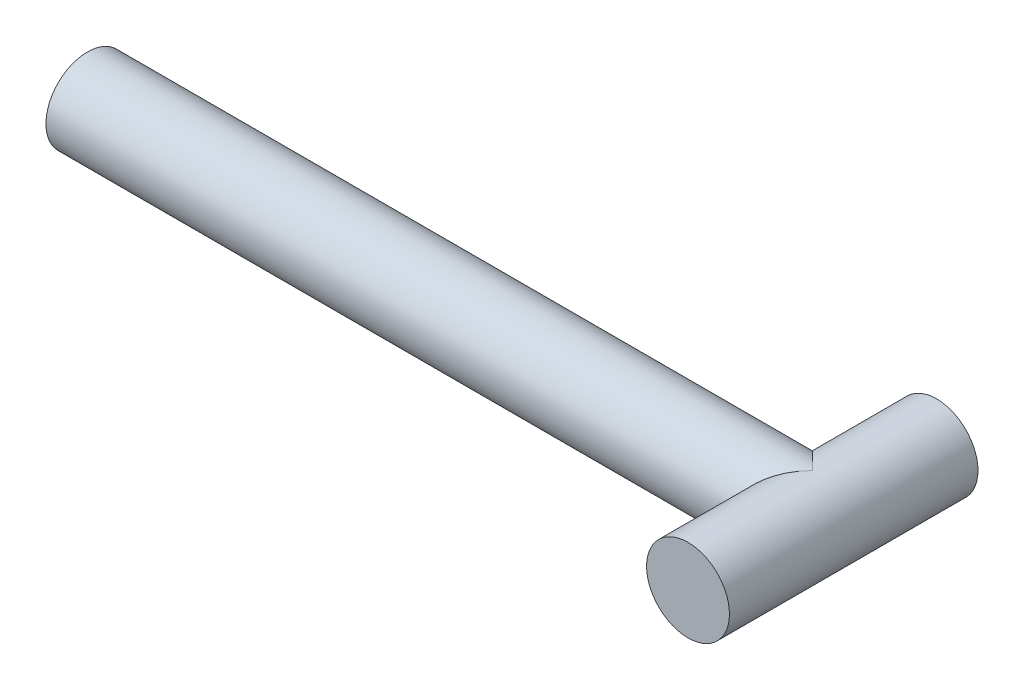
ISO-10303-21;
HEADER;
FILE_DESCRIPTION(('STEP AP214'),'2;1');
FILE_NAME('part.step','',(''),(''),'','','');
FILE_SCHEMA(('AUTOMOTIVE_DESIGN { 1 0 10303 214 1 1 1 1 }'));
ENDSEC;
DATA;
#1=APPLICATION_CONTEXT('core data for automotive mechanical design processes');
#2=APPLICATION_PROTOCOL_DEFINITION('international standard','automotive_design',2000,#1);
#3=PRODUCT_CONTEXT('',#1,'mechanical');
#4=PRODUCT('Part','Part','',(#3));
#5=PRODUCT_RELATED_PRODUCT_CATEGORY('part','',(#4));
#6=PRODUCT_DEFINITION_FORMATION('','',#4);
#7=PRODUCT_DEFINITION_CONTEXT('part definition',#1,'design');
#8=PRODUCT_DEFINITION('design','',#6,#7);
#9=PRODUCT_DEFINITION_SHAPE('','',#8);
#10=(LENGTH_UNIT() NAMED_UNIT(*) SI_UNIT(.MILLI.,.METRE.));
#11=(NAMED_UNIT(*) PLANE_ANGLE_UNIT() SI_UNIT($,.RADIAN.));
#12=(NAMED_UNIT(*) SI_UNIT($,.STERADIAN.) SOLID_ANGLE_UNIT());
#13=UNCERTAINTY_MEASURE_WITH_UNIT(LENGTH_MEASURE(1.E-05),#10,'distance_accuracy_value','');
#14=(GEOMETRIC_REPRESENTATION_CONTEXT(3) GLOBAL_UNCERTAINTY_ASSIGNED_CONTEXT((#13)) GLOBAL_UNIT_ASSIGNED_CONTEXT((#10,
#11,#12)) REPRESENTATION_CONTEXT('',''));
#15=CARTESIAN_POINT('',(0.,0.,0.));
#16=DIRECTION('',(0.,0.,1.));
#17=DIRECTION('',(1.,0.,0.));
#18=AXIS2_PLACEMENT_3D('',#15,#16,#17);
#19=CARTESIAN_POINT('',(0.,0.,12.));
#20=DIRECTION('',(0.,0.,-1.));
#21=DIRECTION('',(-1.,0.,0.));
#22=AXIS2_PLACEMENT_3D('',#19,#20,#21);
#23=CYLINDRICAL_SURFACE('',#22,4.);
#24=CARTESIAN_POINT('',(0.,0.,0.));
#25=DIRECTION('',(0.707106781186547,0.,-0.707106781186547));
#26=DIRECTION('',(0.707106781186547,0.,0.707106781186547));
#27=AXIS2_PLACEMENT_3D('',#24,#25,#26);
#28=ELLIPSE('',#27,5.65685424949238,4.);
#29=CARTESIAN_POINT('',(0.,4.,0.));
#30=VERTEX_POINT('',#29);
#31=CARTESIAN_POINT('',(0.,-4.,0.));
#32=VERTEX_POINT('',#31);
#33=EDGE_CURVE('E43',#30,#32,#28,.F.);
#34=ORIENTED_EDGE('',*,*,#33,.F.);
#35=CARTESIAN_POINT('',(0.,0.,0.));
#36=DIRECTION('',(0.707106781186547,0.,0.707106781186547));
#37=DIRECTION('',(0.707106781186547,0.,-0.707106781186547));
#38=AXIS2_PLACEMENT_3D('',#35,#36,#37);
#39=ELLIPSE('',#38,5.65685424949238,4.);
#40=EDGE_CURVE('E50',#32,#30,#39,.F.);
#41=ORIENTED_EDGE('',*,*,#40,.F.);
#42=EDGE_LOOP('',(#34,#41));
#43=FACE_BOUND('',#42,.T.);
#44=CARTESIAN_POINT('',(0.,0.,12.));
#45=DIRECTION('',(0.,0.,1.));
#46=DIRECTION('',(1.,0.,0.));
#47=AXIS2_PLACEMENT_3D('',#44,#45,#46);
#48=CIRCLE('',#47,4.);
#49=CARTESIAN_POINT('',(4.,0.,12.));
#50=VERTEX_POINT('',#49);
#51=EDGE_CURVE('E53',#50,#50,#48,.T.);
#52=ORIENTED_EDGE('',*,*,#51,.F.);
#53=EDGE_LOOP('',(#52));
#54=FACE_BOUND('',#53,.T.);
#55=CARTESIAN_POINT('',(0.,0.,-12.));
#56=DIRECTION('',(0.,0.,1.));
#57=DIRECTION('',(1.,0.,0.));
#58=AXIS2_PLACEMENT_3D('',#55,#56,#57);
#59=CIRCLE('',#58,4.);
#60=CARTESIAN_POINT('',(4.,0.,-12.));
#61=VERTEX_POINT('',#60);
#62=EDGE_CURVE('E58',#61,#61,#59,.T.);
#63=ORIENTED_EDGE('',*,*,#62,.T.);
#64=EDGE_LOOP('',(#63));
#65=FACE_BOUND('',#64,.T.);
#66=ADVANCED_FACE('F35',(#43,#54,#65),#23,.T.);
#67=CARTESIAN_POINT('',(0.,0.,12.));
#68=DIRECTION('',(0.,0.,1.));
#69=DIRECTION('',(1.,0.,0.));
#70=AXIS2_PLACEMENT_3D('',#67,#68,#69);
#71=PLANE('',#70);
#72=ORIENTED_EDGE('',*,*,#51,.T.);
#73=EDGE_LOOP('',(#72));
#74=FACE_BOUND('',#73,.T.);
#75=ADVANCED_FACE('F65',(#74),#71,.T.);
#76=CARTESIAN_POINT('',(0.,0.,-12.));
#77=DIRECTION('',(0.,0.,1.));
#78=DIRECTION('',(1.,0.,0.));
#79=AXIS2_PLACEMENT_3D('',#76,#77,#78);
#80=PLANE('',#79);
#81=ORIENTED_EDGE('',*,*,#62,.F.);
#82=EDGE_LOOP('',(#81));
#83=FACE_BOUND('',#82,.T.);
#84=ADVANCED_FACE('F63',(#83),#80,.F.);
#85=CARTESIAN_POINT('',(-70.,0.,0.));
#86=DIRECTION('',(1.,0.,0.));
#87=DIRECTION('',(0.,0.,-1.));
#88=AXIS2_PLACEMENT_3D('',#85,#86,#87);
#89=CYLINDRICAL_SURFACE('',#88,4.);
#90=CARTESIAN_POINT('',(-70.,0.,0.));
#91=DIRECTION('',(1.,0.,0.));
#92=DIRECTION('',(0.,0.,-1.));
#93=AXIS2_PLACEMENT_3D('',#90,#91,#92);
#94=CIRCLE('',#93,4.);
#95=CARTESIAN_POINT('',(-70.,0.,-4.));
#96=VERTEX_POINT('',#95);
#97=EDGE_CURVE('E11',#96,#96,#94,.T.);
#98=ORIENTED_EDGE('',*,*,#97,.T.);
#99=EDGE_LOOP('',(#98));
#100=FACE_BOUND('',#99,.T.);
#101=ORIENTED_EDGE('',*,*,#40,.T.);
#102=ORIENTED_EDGE('',*,*,#33,.T.);
#103=EDGE_LOOP('',(#101,#102));
#104=FACE_BOUND('',#103,.T.);
#105=ADVANCED_FACE('F37',(#100,#104),#89,.T.);
#106=CARTESIAN_POINT('',(-70.,0.,0.));
#107=DIRECTION('',(1.,0.,0.));
#108=DIRECTION('',(0.,0.,-1.));
#109=AXIS2_PLACEMENT_3D('',#106,#107,#108);
#110=PLANE('',#109);
#111=ORIENTED_EDGE('',*,*,#97,.F.);
#112=EDGE_LOOP('',(#111));
#113=FACE_BOUND('',#112,.T.);
#114=ADVANCED_FACE('F71',(#113),#110,.F.);
#115=CLOSED_SHELL('',(#66,#75,#84,#105,#114));
#116=MANIFOLD_SOLID_BREP('B2',#115);
#117=ADVANCED_BREP_SHAPE_REPRESENTATION('',(#18,#116),#14);
#118=SHAPE_DEFINITION_REPRESENTATION(#9,#117);
ENDSEC;
END-ISO-10303-21;
